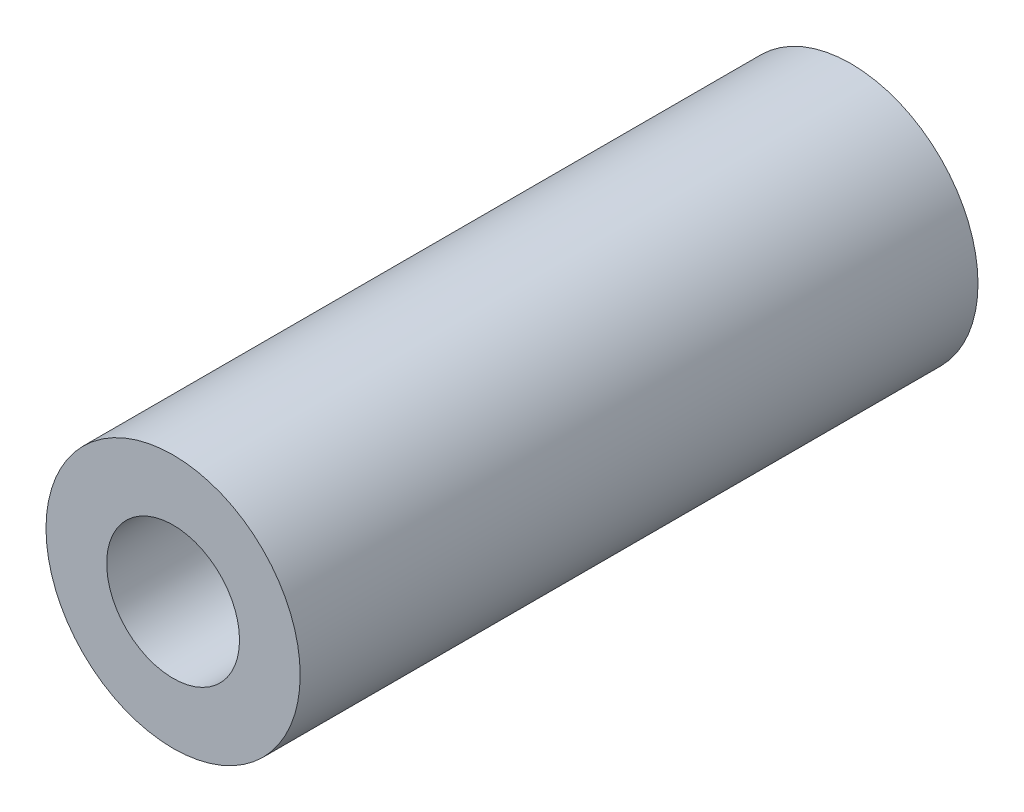
ISO-10303-21;
HEADER;
FILE_DESCRIPTION(('STEP AP214'),'2;1');
FILE_NAME('part.step','',(''),(''),'','','');
FILE_SCHEMA(('AUTOMOTIVE_DESIGN { 1 0 10303 214 1 1 1 1 }'));
ENDSEC;
DATA;
#1=APPLICATION_CONTEXT('core data for automotive mechanical design processes');
#2=APPLICATION_PROTOCOL_DEFINITION('international standard','automotive_design',2000,#1);
#3=PRODUCT_CONTEXT('',#1,'mechanical');
#4=PRODUCT('Part','Part','',(#3));
#5=PRODUCT_RELATED_PRODUCT_CATEGORY('part','',(#4));
#6=PRODUCT_DEFINITION_FORMATION('','',#4);
#7=PRODUCT_DEFINITION_CONTEXT('part definition',#1,'design');
#8=PRODUCT_DEFINITION('design','',#6,#7);
#9=PRODUCT_DEFINITION_SHAPE('','',#8);
#10=(LENGTH_UNIT() NAMED_UNIT(*) SI_UNIT(.MILLI.,.METRE.));
#11=(NAMED_UNIT(*) PLANE_ANGLE_UNIT() SI_UNIT($,.RADIAN.));
#12=(NAMED_UNIT(*) SI_UNIT($,.STERADIAN.) SOLID_ANGLE_UNIT());
#13=UNCERTAINTY_MEASURE_WITH_UNIT(LENGTH_MEASURE(1.E-05),#10,'distance_accuracy_value','');
#14=(GEOMETRIC_REPRESENTATION_CONTEXT(3) GLOBAL_UNCERTAINTY_ASSIGNED_CONTEXT((#13)) GLOBAL_UNIT_ASSIGNED_CONTEXT((#10,
#11,#12)) REPRESENTATION_CONTEXT('',''));
#15=CARTESIAN_POINT('',(0.,0.,0.));
#16=DIRECTION('',(0.,0.,1.));
#17=DIRECTION('',(1.,0.,0.));
#18=AXIS2_PLACEMENT_3D('',#15,#16,#17);
#19=CARTESIAN_POINT('',(0.,0.,12.7));
#20=DIRECTION('',(0.,0.,1.));
#21=DIRECTION('',(1.,0.,0.));
#22=AXIS2_PLACEMENT_3D('',#19,#20,#21);
#23=PLANE('',#22);
#24=CARTESIAN_POINT('',(0.,0.,12.7));
#25=DIRECTION('',(0.,0.,1.));
#26=DIRECTION('',(1.,0.,0.));
#27=AXIS2_PLACEMENT_3D('',#24,#25,#26);
#28=CIRCLE('',#27,4.7625);
#29=CARTESIAN_POINT('',(4.7625,0.,12.7));
#30=VERTEX_POINT('',#29);
#31=EDGE_CURVE('E10',#30,#30,#28,.T.);
#32=ORIENTED_EDGE('',*,*,#31,.T.);
#33=EDGE_LOOP('',(#32));
#34=FACE_BOUND('',#33,.T.);
#35=CARTESIAN_POINT('',(0.,0.,12.7));
#36=DIRECTION('',(0.,0.,1.));
#37=DIRECTION('',(1.,0.,0.));
#38=AXIS2_PLACEMENT_3D('',#35,#36,#37);
#39=CIRCLE('',#38,2.4892);
#40=CARTESIAN_POINT('',(2.4892,0.,12.7));
#41=VERTEX_POINT('',#40);
#42=EDGE_CURVE('E46',#41,#41,#39,.T.);
#43=ORIENTED_EDGE('',*,*,#42,.F.);
#44=EDGE_LOOP('',(#43));
#45=FACE_BOUND('',#44,.T.);
#46=ADVANCED_FACE('F35',(#34,#45),#23,.T.);
#47=CARTESIAN_POINT('',(0.,0.,-12.7));
#48=DIRECTION('',(0.,0.,1.));
#49=DIRECTION('',(1.,0.,0.));
#50=AXIS2_PLACEMENT_3D('',#47,#48,#49);
#51=PLANE('',#50);
#52=CARTESIAN_POINT('',(0.,0.,-12.7));
#53=DIRECTION('',(0.,0.,1.));
#54=DIRECTION('',(1.,0.,0.));
#55=AXIS2_PLACEMENT_3D('',#52,#53,#54);
#56=CIRCLE('',#55,4.7625);
#57=CARTESIAN_POINT('',(4.7625,0.,-12.7));
#58=VERTEX_POINT('',#57);
#59=EDGE_CURVE('E39',#58,#58,#56,.T.);
#60=ORIENTED_EDGE('',*,*,#59,.F.);
#61=EDGE_LOOP('',(#60));
#62=FACE_BOUND('',#61,.T.);
#63=CARTESIAN_POINT('',(0.,0.,-12.7));
#64=DIRECTION('',(0.,0.,1.));
#65=DIRECTION('',(1.,0.,0.));
#66=AXIS2_PLACEMENT_3D('',#63,#64,#65);
#67=CIRCLE('',#66,2.4892);
#68=CARTESIAN_POINT('',(2.4892,0.,-12.7));
#69=VERTEX_POINT('',#68);
#70=EDGE_CURVE('E48',#69,#69,#67,.T.);
#71=ORIENTED_EDGE('',*,*,#70,.T.);
#72=EDGE_LOOP('',(#71));
#73=FACE_BOUND('',#72,.T.);
#74=ADVANCED_FACE('F58',(#62,#73),#51,.F.);
#75=CARTESIAN_POINT('',(0.,0.,12.7));
#76=DIRECTION('',(0.,0.,-1.));
#77=DIRECTION('',(-1.,0.,0.));
#78=AXIS2_PLACEMENT_3D('',#75,#76,#77);
#79=CYLINDRICAL_SURFACE('',#78,4.7625);
#80=ORIENTED_EDGE('',*,*,#31,.F.);
#81=EDGE_LOOP('',(#80));
#82=FACE_BOUND('',#81,.T.);
#83=ORIENTED_EDGE('',*,*,#59,.T.);
#84=EDGE_LOOP('',(#83));
#85=FACE_BOUND('',#84,.T.);
#86=ADVANCED_FACE('F37',(#82,#85),#79,.T.);
#87=CARTESIAN_POINT('',(0.,0.,12.7));
#88=DIRECTION('',(0.,0.,-1.));
#89=DIRECTION('',(-1.,0.,0.));
#90=AXIS2_PLACEMENT_3D('',#87,#88,#89);
#91=CYLINDRICAL_SURFACE('',#90,2.4892);
#92=ORIENTED_EDGE('',*,*,#42,.T.);
#93=EDGE_LOOP('',(#92));
#94=FACE_BOUND('',#93,.T.);
#95=ORIENTED_EDGE('',*,*,#70,.F.);
#96=EDGE_LOOP('',(#95));
#97=FACE_BOUND('',#96,.T.);
#98=ADVANCED_FACE('F54',(#94,#97),#91,.F.);
#99=CLOSED_SHELL('',(#46,#74,#86,#98));
#100=MANIFOLD_SOLID_BREP('B2',#99);
#101=ADVANCED_BREP_SHAPE_REPRESENTATION('',(#18,#100),#14);
#102=SHAPE_DEFINITION_REPRESENTATION(#9,#101);
ENDSEC;
END-ISO-10303-21;
